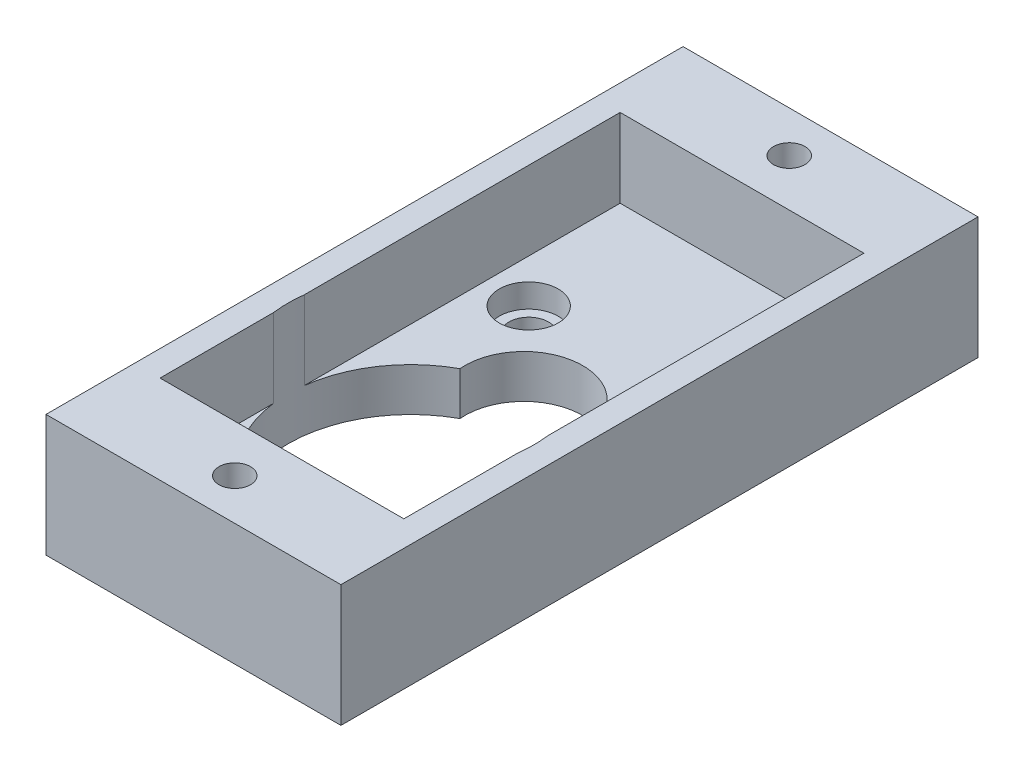
ISO-10303-21;
HEADER;
FILE_DESCRIPTION(('STEP AP214'),'2;1');
FILE_NAME('part.step','',(''),(''),'','','');
FILE_SCHEMA(('AUTOMOTIVE_DESIGN { 1 0 10303 214 1 1 1 1 }'));
ENDSEC;
DATA;
#1=APPLICATION_CONTEXT('core data for automotive mechanical design processes');
#2=APPLICATION_PROTOCOL_DEFINITION('international standard','automotive_design',2000,#1);
#3=PRODUCT_CONTEXT('',#1,'mechanical');
#4=PRODUCT('Part','Part','',(#3));
#5=PRODUCT_RELATED_PRODUCT_CATEGORY('part','',(#4));
#6=PRODUCT_DEFINITION_FORMATION('','',#4);
#7=PRODUCT_DEFINITION_CONTEXT('part definition',#1,'design');
#8=PRODUCT_DEFINITION('design','',#6,#7);
#9=PRODUCT_DEFINITION_SHAPE('','',#8);
#10=(LENGTH_UNIT() NAMED_UNIT(*) SI_UNIT(.MILLI.,.METRE.));
#11=(NAMED_UNIT(*) PLANE_ANGLE_UNIT() SI_UNIT($,.RADIAN.));
#12=(NAMED_UNIT(*) SI_UNIT($,.STERADIAN.) SOLID_ANGLE_UNIT());
#13=UNCERTAINTY_MEASURE_WITH_UNIT(LENGTH_MEASURE(1.E-05),#10,'distance_accuracy_value','');
#14=(GEOMETRIC_REPRESENTATION_CONTEXT(3) GLOBAL_UNCERTAINTY_ASSIGNED_CONTEXT((#13)) GLOBAL_UNIT_ASSIGNED_CONTEXT((#10,
#11,#12)) REPRESENTATION_CONTEXT('',''));
#15=CARTESIAN_POINT('',(0.,0.,0.));
#16=DIRECTION('',(0.,0.,1.));
#17=DIRECTION('',(1.,0.,0.));
#18=AXIS2_PLACEMENT_3D('',#15,#16,#17);
#19=CARTESIAN_POINT('',(11.5,0.,11.35));
#20=DIRECTION('',(0.,1.,0.));
#21=DIRECTION('',(0.,0.,1.));
#22=AXIS2_PLACEMENT_3D('',#19,#20,#21);
#23=CYLINDRICAL_SURFACE('',#22,1.);
#24=CARTESIAN_POINT('',(11.5,0.,11.35));
#25=DIRECTION('',(0.,1.,0.));
#26=DIRECTION('',(0.,0.,1.));
#27=AXIS2_PLACEMENT_3D('',#24,#25,#26);
#28=CIRCLE('',#27,1.);
#29=CARTESIAN_POINT('',(11.5,0.,12.35));
#30=VERTEX_POINT('',#29);
#31=EDGE_CURVE('E677',#30,#30,#28,.T.);
#32=ORIENTED_EDGE('',*,*,#31,.F.);
#33=EDGE_LOOP('',(#32));
#34=FACE_BOUND('',#33,.T.);
#35=CARTESIAN_POINT('',(11.5,1.,11.35));
#36=DIRECTION('',(0.,1.,0.));
#37=DIRECTION('',(0.,0.,1.));
#38=AXIS2_PLACEMENT_3D('',#35,#36,#37);
#39=CIRCLE('',#38,1.);
#40=CARTESIAN_POINT('',(11.5,1.,12.35));
#41=VERTEX_POINT('',#40);
#42=EDGE_CURVE('E670',#41,#41,#39,.T.);
#43=ORIENTED_EDGE('',*,*,#42,.T.);
#44=EDGE_LOOP('',(#43));
#45=FACE_BOUND('',#44,.T.);
#46=ADVANCED_FACE('F46',(#34,#45),#23,.F.);
#47=CARTESIAN_POINT('',(3.5,0.,11.35));
#48=DIRECTION('',(0.,1.,0.));
#49=DIRECTION('',(0.,0.,1.));
#50=AXIS2_PLACEMENT_3D('',#47,#48,#49);
#51=CYLINDRICAL_SURFACE('',#50,1.);
#52=CARTESIAN_POINT('',(3.5,0.,11.35));
#53=DIRECTION('',(0.,1.,0.));
#54=DIRECTION('',(0.,0.,1.));
#55=AXIS2_PLACEMENT_3D('',#52,#53,#54);
#56=CIRCLE('',#55,1.);
#57=CARTESIAN_POINT('',(3.5,0.,12.35));
#58=VERTEX_POINT('',#57);
#59=EDGE_CURVE('E675',#58,#58,#56,.T.);
#60=ORIENTED_EDGE('',*,*,#59,.F.);
#61=EDGE_LOOP('',(#60));
#62=FACE_BOUND('',#61,.T.);
#63=CARTESIAN_POINT('',(3.5,1.,11.35));
#64=DIRECTION('',(0.,1.,0.));
#65=DIRECTION('',(0.,0.,1.));
#66=AXIS2_PLACEMENT_3D('',#63,#64,#65);
#67=CIRCLE('',#66,1.);
#68=CARTESIAN_POINT('',(3.5,1.,12.35));
#69=VERTEX_POINT('',#68);
#70=EDGE_CURVE('E667',#69,#69,#67,.T.);
#71=ORIENTED_EDGE('',*,*,#70,.T.);
#72=EDGE_LOOP('',(#71));
#73=FACE_BOUND('',#72,.T.);
#74=ADVANCED_FACE('F277',(#62,#73),#51,.F.);
#75=CARTESIAN_POINT('',(0.,2.2,0.));
#76=DIRECTION('',(0.,-1.,0.));
#77=DIRECTION('',(0.,0.,-1.));
#78=AXIS2_PLACEMENT_3D('',#75,#76,#77);
#79=PLANE('',#78);
#80=CARTESIAN_POINT('',(11.5,2.2,11.35));
#81=DIRECTION('',(0.,1.,0.));
#82=DIRECTION('',(0.,0.,1.));
#83=AXIS2_PLACEMENT_3D('',#80,#81,#82);
#84=CIRCLE('',#83,1.5);
#85=CARTESIAN_POINT('',(11.5,2.2,12.85));
#86=VERTEX_POINT('',#85);
#87=EDGE_CURVE('E661',#86,#86,#84,.T.);
#88=ORIENTED_EDGE('',*,*,#87,.F.);
#89=EDGE_LOOP('',(#88));
#90=FACE_BOUND('',#89,.T.);
#91=CARTESIAN_POINT('',(3.5,2.2,11.35));
#92=DIRECTION('',(0.,1.,0.));
#93=DIRECTION('',(0.,0.,1.));
#94=AXIS2_PLACEMENT_3D('',#91,#92,#93);
#95=CIRCLE('',#94,1.5);
#96=CARTESIAN_POINT('',(3.5,2.2,12.85));
#97=VERTEX_POINT('',#96);
#98=EDGE_CURVE('E664',#97,#97,#95,.T.);
#99=ORIENTED_EDGE('',*,*,#98,.F.);
#100=EDGE_LOOP('',(#99));
#101=FACE_BOUND('',#100,.T.);
#102=CARTESIAN_POINT('',(7.5,2.2,21.35));
#103=DIRECTION('',(0.,1.,0.));
#104=DIRECTION('',(0.,0.,1.));
#105=AXIS2_PLACEMENT_3D('',#102,#103,#104);
#106=CIRCLE('',#105,6.25);
#107=CARTESIAN_POINT('',(13.7,2.2,20.561013308097));
#108=VERTEX_POINT('',#107);
#109=CARTESIAN_POINT('',(10.4886363227973,2.2,15.8608695652174));
#110=VERTEX_POINT('',#109);
#111=EDGE_CURVE('E238',#108,#110,#106,.T.);
#112=ORIENTED_EDGE('',*,*,#111,.F.);
#113=DIRECTION('',(0.,0.,-1.));
#114=VECTOR('',#113,1.);
#115=CARTESIAN_POINT('',(13.7,2.2,0.));
#116=LINE('',#115,#114);
#117=CARTESIAN_POINT('',(13.7,2.2,4.5));
#118=VERTEX_POINT('',#117);
#119=EDGE_CURVE('E177',#108,#118,#116,.T.);
#120=ORIENTED_EDGE('',*,*,#119,.T.);
#121=DIRECTION('',(-1.,0.,0.));
#122=VECTOR('',#121,1.);
#123=CARTESIAN_POINT('',(0.,2.2,4.50000000000001));
#124=LINE('',#123,#122);
#125=CARTESIAN_POINT('',(1.3,2.2,4.50000000000001));
#126=VERTEX_POINT('',#125);
#127=EDGE_CURVE('E208',#118,#126,#124,.T.);
#128=ORIENTED_EDGE('',*,*,#127,.T.);
#129=DIRECTION('',(0.,0.,1.));
#130=VECTOR('',#129,1.);
#131=CARTESIAN_POINT('',(1.3,2.2,0.));
#132=LINE('',#131,#130);
#133=CARTESIAN_POINT('',(1.3,2.2,20.561013308097));
#134=VERTEX_POINT('',#133);
#135=EDGE_CURVE('E207',#126,#134,#132,.T.);
#136=ORIENTED_EDGE('',*,*,#135,.T.);
#137=CARTESIAN_POINT('',(4.5113636772027,2.2,15.8608695652174));
#138=VERTEX_POINT('',#137);
#139=EDGE_CURVE('E234',#138,#134,#106,.T.);
#140=ORIENTED_EDGE('',*,*,#139,.F.);
#141=CARTESIAN_POINT('',(7.49999999999999,2.2,15.6));
#142=DIRECTION('',(0.,1.,0.));
#143=DIRECTION('',(0.,0.,1.));
#144=AXIS2_PLACEMENT_3D('',#141,#142,#143);
#145=CIRCLE('',#144,3.);
#146=EDGE_CURVE('E71',#110,#138,#145,.T.);
#147=ORIENTED_EDGE('',*,*,#146,.F.);
#148=EDGE_LOOP('',(#112,#120,#128,#136,#140,#147));
#149=FACE_BOUND('',#148,.T.);
#150=ADVANCED_FACE('F272',(#90,#101,#149),#79,.F.);
#151=CARTESIAN_POINT('',(0.,2.2,0.));
#152=DIRECTION('',(0.,0.,-1.));
#153=DIRECTION('',(-1.,0.,0.));
#154=AXIS2_PLACEMENT_3D('',#151,#152,#153);
#155=PLANE('',#154);
#156=DIRECTION('',(1.,0.,0.));
#157=VECTOR('',#156,1.);
#158=CARTESIAN_POINT('',(0.,0.,0.));
#159=LINE('',#158,#157);
#160=CARTESIAN_POINT('',(0.,0.,0.));
#161=VERTEX_POINT('',#160);
#162=CARTESIAN_POINT('',(15.,0.,0.));
#163=VERTEX_POINT('',#162);
#164=EDGE_CURVE('E244',#161,#163,#159,.T.);
#165=ORIENTED_EDGE('',*,*,#164,.F.);
#166=DIRECTION('',(0.,-1.,0.));
#167=VECTOR('',#166,1.);
#168=CARTESIAN_POINT('',(0.,2.2,0.));
#169=LINE('',#168,#167);
#170=CARTESIAN_POINT('',(0.,6.2,0.));
#171=VERTEX_POINT('',#170);
#172=EDGE_CURVE('E12',#171,#161,#169,.T.);
#173=ORIENTED_EDGE('',*,*,#172,.F.);
#174=DIRECTION('',(-1.,0.,0.));
#175=VECTOR('',#174,1.);
#176=CARTESIAN_POINT('',(0.,6.2,0.));
#177=LINE('',#176,#175);
#178=CARTESIAN_POINT('',(15.,6.2,0.));
#179=VERTEX_POINT('',#178);
#180=EDGE_CURVE('E173',#179,#171,#177,.T.);
#181=ORIENTED_EDGE('',*,*,#180,.F.);
#182=DIRECTION('',(0.,-1.,0.));
#183=VECTOR('',#182,1.);
#184=CARTESIAN_POINT('',(15.,2.2,0.));
#185=LINE('',#184,#183);
#186=EDGE_CURVE('E50',#179,#163,#185,.T.);
#187=ORIENTED_EDGE('',*,*,#186,.T.);
#188=EDGE_LOOP('',(#165,#173,#181,#187));
#189=FACE_BOUND('',#188,.T.);
#190=ADVANCED_FACE('F48',(#189),#155,.T.);
#191=CARTESIAN_POINT('',(0.,2.2,0.));
#192=DIRECTION('',(1.,0.,0.));
#193=DIRECTION('',(0.,0.,-1.));
#194=AXIS2_PLACEMENT_3D('',#191,#192,#193);
#195=PLANE('',#194);
#196=DIRECTION('',(0.,0.,1.));
#197=VECTOR('',#196,1.);
#198=CARTESIAN_POINT('',(0.,0.,0.));
#199=LINE('',#198,#197);
#200=CARTESIAN_POINT('',(0.,0.,32.4));
#201=VERTEX_POINT('',#200);
#202=EDGE_CURVE('E155',#161,#201,#199,.T.);
#203=ORIENTED_EDGE('',*,*,#202,.T.);
#204=DIRECTION('',(0.,-1.,0.));
#205=VECTOR('',#204,1.);
#206=CARTESIAN_POINT('',(0.,2.2,32.4));
#207=LINE('',#206,#205);
#208=CARTESIAN_POINT('',(0.,6.2,32.4));
#209=VERTEX_POINT('',#208);
#210=EDGE_CURVE('E55',#209,#201,#207,.T.);
#211=ORIENTED_EDGE('',*,*,#210,.F.);
#212=DIRECTION('',(0.,0.,1.));
#213=VECTOR('',#212,1.);
#214=CARTESIAN_POINT('',(0.,6.2,0.));
#215=LINE('',#214,#213);
#216=EDGE_CURVE('E153',#171,#209,#215,.T.);
#217=ORIENTED_EDGE('',*,*,#216,.F.);
#218=ORIENTED_EDGE('',*,*,#172,.T.);
#219=EDGE_LOOP('',(#203,#211,#217,#218));
#220=FACE_BOUND('',#219,.T.);
#221=ADVANCED_FACE('F151',(#220),#195,.F.);
#222=CARTESIAN_POINT('',(0.,2.2,32.4));
#223=DIRECTION('',(0.,0.,-1.));
#224=DIRECTION('',(-1.,0.,0.));
#225=AXIS2_PLACEMENT_3D('',#222,#223,#224);
#226=PLANE('',#225);
#227=DIRECTION('',(1.,0.,0.));
#228=VECTOR('',#227,1.);
#229=CARTESIAN_POINT('',(0.,0.,32.4));
#230=LINE('',#229,#228);
#231=CARTESIAN_POINT('',(15.,0.,32.4));
#232=VERTEX_POINT('',#231);
#233=EDGE_CURVE('E250',#201,#232,#230,.T.);
#234=ORIENTED_EDGE('',*,*,#233,.T.);
#235=DIRECTION('',(0.,-1.,0.));
#236=VECTOR('',#235,1.);
#237=CARTESIAN_POINT('',(15.,2.2,32.4));
#238=LINE('',#237,#236);
#239=CARTESIAN_POINT('',(15.,6.2,32.4));
#240=VERTEX_POINT('',#239);
#241=EDGE_CURVE('E159',#240,#232,#238,.T.);
#242=ORIENTED_EDGE('',*,*,#241,.F.);
#243=DIRECTION('',(1.,0.,0.));
#244=VECTOR('',#243,1.);
#245=CARTESIAN_POINT('',(0.,6.2,32.4));
#246=LINE('',#245,#244);
#247=EDGE_CURVE('E162',#209,#240,#246,.T.);
#248=ORIENTED_EDGE('',*,*,#247,.F.);
#249=ORIENTED_EDGE('',*,*,#210,.T.);
#250=EDGE_LOOP('',(#234,#242,#248,#249));
#251=FACE_BOUND('',#250,.T.);
#252=ADVANCED_FACE('F163',(#251),#226,.F.);
#253=CARTESIAN_POINT('',(15.,2.2,0.));
#254=DIRECTION('',(1.,0.,0.));
#255=DIRECTION('',(0.,0.,-1.));
#256=AXIS2_PLACEMENT_3D('',#253,#254,#255);
#257=PLANE('',#256);
#258=DIRECTION('',(0.,0.,1.));
#259=VECTOR('',#258,1.);
#260=CARTESIAN_POINT('',(15.,0.,0.));
#261=LINE('',#260,#259);
#262=EDGE_CURVE('E247',#163,#232,#261,.T.);
#263=ORIENTED_EDGE('',*,*,#262,.F.);
#264=ORIENTED_EDGE('',*,*,#186,.F.);
#265=DIRECTION('',(0.,0.,-1.));
#266=VECTOR('',#265,1.);
#267=CARTESIAN_POINT('',(15.,6.2,0.));
#268=LINE('',#267,#266);
#269=EDGE_CURVE('E167',#240,#179,#268,.T.);
#270=ORIENTED_EDGE('',*,*,#269,.F.);
#271=ORIENTED_EDGE('',*,*,#241,.T.);
#272=EDGE_LOOP('',(#263,#264,#270,#271));
#273=FACE_BOUND('',#272,.T.);
#274=ADVANCED_FACE('F256',(#273),#257,.T.);
#275=DIRECTION('',(-1.,0.,0.));
#276=VECTOR('',#275,1.);
#277=CARTESIAN_POINT('',(0.,2.2,27.9));
#278=LINE('',#277,#276);
#279=CARTESIAN_POINT('',(13.7,2.2,27.9));
#280=VERTEX_POINT('',#279);
#281=CARTESIAN_POINT('',(1.3,2.2,27.9));
#282=VERTEX_POINT('',#281);
#283=EDGE_CURVE('E63',#280,#282,#278,.T.);
#284=ORIENTED_EDGE('',*,*,#283,.F.);
#285=CARTESIAN_POINT('',(13.7,2.2,22.138986691903));
#286=VERTEX_POINT('',#285);
#287=EDGE_CURVE('E174',#280,#286,#116,.T.);
#288=ORIENTED_EDGE('',*,*,#287,.T.);
#289=CARTESIAN_POINT('',(1.3,2.2,22.138986691903));
#290=VERTEX_POINT('',#289);
#291=EDGE_CURVE('E237',#290,#286,#106,.T.);
#292=ORIENTED_EDGE('',*,*,#291,.F.);
#293=EDGE_CURVE('E203',#290,#282,#132,.T.);
#294=ORIENTED_EDGE('',*,*,#293,.T.);
#295=EDGE_LOOP('',(#284,#288,#292,#294));
#296=FACE_BOUND('',#295,.T.);
#297=ADVANCED_FACE('F261',(#296),#79,.F.);
#298=CARTESIAN_POINT('',(0.,0.,0.));
#299=DIRECTION('',(0.,-1.,0.));
#300=DIRECTION('',(0.,0.,-1.));
#301=AXIS2_PLACEMENT_3D('',#298,#299,#300);
#302=PLANE('',#301);
#303=ORIENTED_EDGE('',*,*,#59,.T.);
#304=EDGE_LOOP('',(#303));
#305=FACE_BOUND('',#304,.T.);
#306=ORIENTED_EDGE('',*,*,#31,.T.);
#307=EDGE_LOOP('',(#306));
#308=FACE_BOUND('',#307,.T.);
#309=CARTESIAN_POINT('',(7.5,0.,21.35));
#310=DIRECTION('',(0.,1.,0.));
#311=DIRECTION('',(0.,0.,1.));
#312=AXIS2_PLACEMENT_3D('',#309,#310,#311);
#313=CIRCLE('',#312,6.25);
#314=CARTESIAN_POINT('',(4.5113636772027,0.,15.8608695652174));
#315=VERTEX_POINT('',#314);
#316=CARTESIAN_POINT('',(10.4886363227973,0.,15.8608695652174));
#317=VERTEX_POINT('',#316);
#318=EDGE_CURVE('E228',#315,#317,#313,.T.);
#319=ORIENTED_EDGE('',*,*,#318,.T.);
#320=CARTESIAN_POINT('',(7.49999999999999,0.,15.6));
#321=DIRECTION('',(0.,1.,0.));
#322=DIRECTION('',(0.,0.,1.));
#323=AXIS2_PLACEMENT_3D('',#320,#321,#322);
#324=CIRCLE('',#323,3.);
#325=EDGE_CURVE('E231',#317,#315,#324,.T.);
#326=ORIENTED_EDGE('',*,*,#325,.T.);
#327=EDGE_LOOP('',(#319,#326));
#328=FACE_BOUND('',#327,.T.);
#329=ORIENTED_EDGE('',*,*,#164,.T.);
#330=ORIENTED_EDGE('',*,*,#262,.T.);
#331=ORIENTED_EDGE('',*,*,#233,.F.);
#332=ORIENTED_EDGE('',*,*,#202,.F.);
#333=EDGE_LOOP('',(#329,#330,#331,#332));
#334=FACE_BOUND('',#333,.T.);
#335=ADVANCED_FACE('F258',(#305,#308,#328,#334),#302,.T.);
#336=CARTESIAN_POINT('',(7.49999999999999,2.2,15.6));
#337=DIRECTION('',(0.,-1.,0.));
#338=DIRECTION('',(0.,0.,-1.));
#339=AXIS2_PLACEMENT_3D('',#336,#337,#338);
#340=CYLINDRICAL_SURFACE('',#339,3.);
#341=DIRECTION('',(0.,-1.,0.));
#342=VECTOR('',#341,1.);
#343=CARTESIAN_POINT('',(4.5113636772027,1.1,15.8608695652174));
#344=LINE('',#343,#342);
#345=EDGE_CURVE('E242',#138,#315,#344,.T.);
#346=ORIENTED_EDGE('',*,*,#345,.T.);
#347=ORIENTED_EDGE('',*,*,#325,.F.);
#348=DIRECTION('',(0.,-1.,0.));
#349=VECTOR('',#348,1.);
#350=CARTESIAN_POINT('',(10.4886363227973,1.1,15.8608695652174));
#351=LINE('',#350,#349);
#352=EDGE_CURVE('E230',#317,#110,#351,.F.);
#353=ORIENTED_EDGE('',*,*,#352,.T.);
#354=ORIENTED_EDGE('',*,*,#146,.T.);
#355=EDGE_LOOP('',(#346,#347,#353,#354));
#356=FACE_BOUND('',#355,.T.);
#357=ADVANCED_FACE('F260',(#356),#340,.F.);
#358=CARTESIAN_POINT('',(7.5,2.2,21.35));
#359=DIRECTION('',(0.,-1.,0.));
#360=DIRECTION('',(0.,0.,-1.));
#361=AXIS2_PLACEMENT_3D('',#358,#359,#360);
#362=CYLINDRICAL_SURFACE('',#361,6.25);
#363=ORIENTED_EDGE('',*,*,#139,.T.);
#364=DIRECTION('',(0.,-1.,0.));
#365=VECTOR('',#364,1.);
#366=CARTESIAN_POINT('',(1.3,6.2,20.561013308097));
#367=LINE('',#366,#365);
#368=CARTESIAN_POINT('',(1.3,6.2,20.561013308097));
#369=VERTEX_POINT('',#368);
#370=EDGE_CURVE('E222',#369,#134,#367,.T.);
#371=ORIENTED_EDGE('',*,*,#370,.F.);
#372=CARTESIAN_POINT('',(7.5,6.2,21.35));
#373=DIRECTION('',(0.,1.,0.));
#374=DIRECTION('',(0.,0.,1.));
#375=AXIS2_PLACEMENT_3D('',#372,#373,#374);
#376=CIRCLE('',#375,6.25);
#377=CARTESIAN_POINT('',(1.3,6.2,22.138986691903));
#378=VERTEX_POINT('',#377);
#379=EDGE_CURVE('E190',#378,#369,#376,.F.);
#380=ORIENTED_EDGE('',*,*,#379,.F.);
#381=DIRECTION('',(0.,-1.,0.));
#382=VECTOR('',#381,1.);
#383=CARTESIAN_POINT('',(1.3,6.2,22.138986691903));
#384=LINE('',#383,#382);
#385=EDGE_CURVE('E224',#378,#290,#384,.T.);
#386=ORIENTED_EDGE('',*,*,#385,.T.);
#387=ORIENTED_EDGE('',*,*,#291,.T.);
#388=DIRECTION('',(0.,-1.,0.));
#389=VECTOR('',#388,1.);
#390=CARTESIAN_POINT('',(13.7,6.2,22.138986691903));
#391=LINE('',#390,#389);
#392=CARTESIAN_POINT('',(13.7,6.2,22.138986691903));
#393=VERTEX_POINT('',#392);
#394=EDGE_CURVE('E214',#393,#286,#391,.T.);
#395=ORIENTED_EDGE('',*,*,#394,.F.);
#396=CARTESIAN_POINT('',(7.5,6.2,21.35));
#397=DIRECTION('',(0.,1.,0.));
#398=DIRECTION('',(0.,0.,1.));
#399=AXIS2_PLACEMENT_3D('',#396,#397,#398);
#400=CIRCLE('',#399,6.25);
#401=CARTESIAN_POINT('',(13.7,6.2,20.561013308097));
#402=VERTEX_POINT('',#401);
#403=EDGE_CURVE('E199',#402,#393,#400,.F.);
#404=ORIENTED_EDGE('',*,*,#403,.F.);
#405=DIRECTION('',(0.,-1.,0.));
#406=VECTOR('',#405,1.);
#407=CARTESIAN_POINT('',(13.7,6.2,20.561013308097));
#408=LINE('',#407,#406);
#409=EDGE_CURVE('E216',#402,#108,#408,.T.);
#410=ORIENTED_EDGE('',*,*,#409,.T.);
#411=ORIENTED_EDGE('',*,*,#111,.T.);
#412=ORIENTED_EDGE('',*,*,#352,.F.);
#413=ORIENTED_EDGE('',*,*,#318,.F.);
#414=ORIENTED_EDGE('',*,*,#345,.F.);
#415=EDGE_LOOP('',(#363,#371,#380,#386,#387,#395,#404,#410,#411,#412,#413,#414));
#416=FACE_BOUND('',#415,.T.);
#417=ADVANCED_FACE('F268',(#416),#362,.F.);
#418=CARTESIAN_POINT('',(0.,6.2,27.9));
#419=DIRECTION('',(0.,0.,1.));
#420=DIRECTION('',(1.,0.,0.));
#421=AXIS2_PLACEMENT_3D('',#418,#419,#420);
#422=PLANE('',#421);
#423=ORIENTED_EDGE('',*,*,#283,.T.);
#424=DIRECTION('',(0.,-1.,0.));
#425=VECTOR('',#424,1.);
#426=CARTESIAN_POINT('',(1.3,6.2,27.9));
#427=LINE('',#426,#425);
#428=CARTESIAN_POINT('',(1.3,6.2,27.9));
#429=VERTEX_POINT('',#428);
#430=EDGE_CURVE('E226',#429,#282,#427,.T.);
#431=ORIENTED_EDGE('',*,*,#430,.F.);
#432=DIRECTION('',(-1.,0.,0.));
#433=VECTOR('',#432,1.);
#434=CARTESIAN_POINT('',(0.,6.2,27.9));
#435=LINE('',#434,#433);
#436=CARTESIAN_POINT('',(13.7,6.2,27.9));
#437=VERTEX_POINT('',#436);
#438=EDGE_CURVE('E185',#437,#429,#435,.T.);
#439=ORIENTED_EDGE('',*,*,#438,.F.);
#440=DIRECTION('',(0.,-1.,0.));
#441=VECTOR('',#440,1.);
#442=CARTESIAN_POINT('',(13.7,6.2,27.9));
#443=LINE('',#442,#441);
#444=EDGE_CURVE('E212',#437,#280,#443,.T.);
#445=ORIENTED_EDGE('',*,*,#444,.T.);
#446=EDGE_LOOP('',(#423,#431,#439,#445));
#447=FACE_BOUND('',#446,.T.);
#448=ADVANCED_FACE('F323',(#447),#422,.F.);
#449=CARTESIAN_POINT('',(1.3,6.2,0.));
#450=DIRECTION('',(1.,0.,0.));
#451=DIRECTION('',(0.,0.,-1.));
#452=AXIS2_PLACEMENT_3D('',#449,#450,#451);
#453=PLANE('',#452);
#454=ORIENTED_EDGE('',*,*,#293,.F.);
#455=ORIENTED_EDGE('',*,*,#385,.F.);
#456=DIRECTION('',(0.,0.,1.));
#457=VECTOR('',#456,1.);
#458=CARTESIAN_POINT('',(1.3,6.2,0.));
#459=LINE('',#458,#457);
#460=EDGE_CURVE('E187',#378,#429,#459,.T.);
#461=ORIENTED_EDGE('',*,*,#460,.T.);
#462=ORIENTED_EDGE('',*,*,#430,.T.);
#463=EDGE_LOOP('',(#454,#455,#461,#462));
#464=FACE_BOUND('',#463,.T.);
#465=ADVANCED_FACE('F321',(#464),#453,.T.);
#466=ORIENTED_EDGE('',*,*,#135,.F.);
#467=DIRECTION('',(0.,-1.,0.));
#468=VECTOR('',#467,1.);
#469=CARTESIAN_POINT('',(1.3,6.2,4.50000000000001));
#470=LINE('',#469,#468);
#471=CARTESIAN_POINT('',(1.3,6.2,4.50000000000001));
#472=VERTEX_POINT('',#471);
#473=EDGE_CURVE('E220',#472,#126,#470,.T.);
#474=ORIENTED_EDGE('',*,*,#473,.F.);
#475=EDGE_CURVE('E191',#472,#369,#459,.T.);
#476=ORIENTED_EDGE('',*,*,#475,.T.);
#477=ORIENTED_EDGE('',*,*,#370,.T.);
#478=EDGE_LOOP('',(#466,#474,#476,#477));
#479=FACE_BOUND('',#478,.T.);
#480=ADVANCED_FACE('F317',(#479),#453,.T.);
#481=CARTESIAN_POINT('',(0.,6.2,4.50000000000001));
#482=DIRECTION('',(0.,0.,1.));
#483=DIRECTION('',(1.,0.,0.));
#484=AXIS2_PLACEMENT_3D('',#481,#482,#483);
#485=PLANE('',#484);
#486=ORIENTED_EDGE('',*,*,#127,.F.);
#487=DIRECTION('',(0.,-1.,0.));
#488=VECTOR('',#487,1.);
#489=CARTESIAN_POINT('',(13.7,6.2,4.5));
#490=LINE('',#489,#488);
#491=CARTESIAN_POINT('',(13.7,6.2,4.5));
#492=VERTEX_POINT('',#491);
#493=EDGE_CURVE('E218',#492,#118,#490,.T.);
#494=ORIENTED_EDGE('',*,*,#493,.F.);
#495=DIRECTION('',(-1.,0.,0.));
#496=VECTOR('',#495,1.);
#497=CARTESIAN_POINT('',(0.,6.2,4.50000000000001));
#498=LINE('',#497,#496);
#499=EDGE_CURVE('E193',#492,#472,#498,.T.);
#500=ORIENTED_EDGE('',*,*,#499,.T.);
#501=ORIENTED_EDGE('',*,*,#473,.T.);
#502=EDGE_LOOP('',(#486,#494,#500,#501));
#503=FACE_BOUND('',#502,.T.);
#504=ADVANCED_FACE('F314',(#503),#485,.T.);
#505=CARTESIAN_POINT('',(13.7,6.2,0.));
#506=DIRECTION('',(-1.,0.,0.));
#507=DIRECTION('',(0.,0.,1.));
#508=AXIS2_PLACEMENT_3D('',#505,#506,#507);
#509=PLANE('',#508);
#510=ORIENTED_EDGE('',*,*,#119,.F.);
#511=ORIENTED_EDGE('',*,*,#409,.F.);
#512=DIRECTION('',(0.,0.,-1.));
#513=VECTOR('',#512,1.);
#514=CARTESIAN_POINT('',(13.7,6.2,0.));
#515=LINE('',#514,#513);
#516=EDGE_CURVE('E196',#402,#492,#515,.T.);
#517=ORIENTED_EDGE('',*,*,#516,.T.);
#518=ORIENTED_EDGE('',*,*,#493,.T.);
#519=EDGE_LOOP('',(#510,#511,#517,#518));
#520=FACE_BOUND('',#519,.T.);
#521=ADVANCED_FACE('F312',(#520),#509,.T.);
#522=ORIENTED_EDGE('',*,*,#287,.F.);
#523=ORIENTED_EDGE('',*,*,#444,.F.);
#524=EDGE_CURVE('E200',#437,#393,#515,.T.);
#525=ORIENTED_EDGE('',*,*,#524,.T.);
#526=ORIENTED_EDGE('',*,*,#394,.T.);
#527=EDGE_LOOP('',(#522,#523,#525,#526));
#528=FACE_BOUND('',#527,.T.);
#529=ADVANCED_FACE('F308',(#528),#509,.T.);
#530=CARTESIAN_POINT('',(0.,6.2,0.));
#531=DIRECTION('',(0.,1.,0.));
#532=DIRECTION('',(0.,0.,1.));
#533=AXIS2_PLACEMENT_3D('',#530,#531,#532);
#534=PLANE('',#533);
#535=CARTESIAN_POINT('',(7.50000000000002,6.2,2.1));
#536=DIRECTION('',(0.,1.,0.));
#537=DIRECTION('',(-1.,0.,0.));
#538=AXIS2_PLACEMENT_3D('',#535,#536,#537);
#539=CIRCLE('',#538,0.800000000000001);
#540=CARTESIAN_POINT('',(6.70000000000002,6.2,2.1));
#541=VERTEX_POINT('',#540);
#542=EDGE_CURVE('E683',#541,#541,#539,.T.);
#543=ORIENTED_EDGE('',*,*,#542,.F.);
#544=EDGE_LOOP('',(#543));
#545=FACE_BOUND('',#544,.T.);
#546=CARTESIAN_POINT('',(7.50000000000002,6.2,30.3));
#547=DIRECTION('',(0.,1.,0.));
#548=DIRECTION('',(-1.,0.,0.));
#549=AXIS2_PLACEMENT_3D('',#546,#547,#548);
#550=CIRCLE('',#549,0.8);
#551=CARTESIAN_POINT('',(6.70000000000002,6.2,30.3));
#552=VERTEX_POINT('',#551);
#553=EDGE_CURVE('E685',#552,#552,#550,.T.);
#554=ORIENTED_EDGE('',*,*,#553,.F.);
#555=EDGE_LOOP('',(#554));
#556=FACE_BOUND('',#555,.T.);
#557=ORIENTED_EDGE('',*,*,#216,.T.);
#558=ORIENTED_EDGE('',*,*,#247,.T.);
#559=ORIENTED_EDGE('',*,*,#269,.T.);
#560=ORIENTED_EDGE('',*,*,#180,.T.);
#561=EDGE_LOOP('',(#557,#558,#559,#560));
#562=FACE_BOUND('',#561,.T.);
#563=ORIENTED_EDGE('',*,*,#438,.T.);
#564=ORIENTED_EDGE('',*,*,#460,.F.);
#565=ORIENTED_EDGE('',*,*,#379,.T.);
#566=ORIENTED_EDGE('',*,*,#475,.F.);
#567=ORIENTED_EDGE('',*,*,#499,.F.);
#568=ORIENTED_EDGE('',*,*,#516,.F.);
#569=ORIENTED_EDGE('',*,*,#403,.T.);
#570=ORIENTED_EDGE('',*,*,#524,.F.);
#571=EDGE_LOOP('',(#563,#564,#565,#566,#567,#568,#569,#570));
#572=FACE_BOUND('',#571,.T.);
#573=ADVANCED_FACE('F170',(#545,#556,#562,#572),#534,.T.);
#574=CARTESIAN_POINT('',(7.50000000000002,3.2,30.3));
#575=DIRECTION('',(0.,1.,0.));
#576=DIRECTION('',(-1.,0.,0.));
#577=AXIS2_PLACEMENT_3D('',#574,#575,#576);
#578=CYLINDRICAL_SURFACE('',#577,0.8);
#579=CARTESIAN_POINT('',(7.50000000000002,3.2,30.3));
#580=DIRECTION('',(0.,1.,0.));
#581=DIRECTION('',(-1.,0.,0.));
#582=AXIS2_PLACEMENT_3D('',#579,#580,#581);
#583=CIRCLE('',#582,0.8);
#584=CARTESIAN_POINT('',(6.70000000000002,3.2,30.3));
#585=VERTEX_POINT('',#584);
#586=EDGE_CURVE('E180',#585,#585,#583,.T.);
#587=ORIENTED_EDGE('',*,*,#586,.F.);
#588=EDGE_LOOP('',(#587));
#589=FACE_BOUND('',#588,.T.);
#590=ORIENTED_EDGE('',*,*,#553,.T.);
#591=EDGE_LOOP('',(#590));
#592=FACE_BOUND('',#591,.T.);
#593=ADVANCED_FACE('F299',(#589,#592),#578,.F.);
#594=CARTESIAN_POINT('',(7.50000000000002,3.2,30.3));
#595=DIRECTION('',(0.,1.,0.));
#596=DIRECTION('',(-1.,0.,0.));
#597=AXIS2_PLACEMENT_3D('',#594,#595,#596);
#598=PLANE('',#597);
#599=ORIENTED_EDGE('',*,*,#586,.T.);
#600=EDGE_LOOP('',(#599));
#601=FACE_BOUND('',#600,.T.);
#602=ADVANCED_FACE('F297',(#601),#598,.T.);
#603=CARTESIAN_POINT('',(7.50000000000002,3.2,2.1));
#604=DIRECTION('',(0.,1.,0.));
#605=DIRECTION('',(-1.,0.,0.));
#606=AXIS2_PLACEMENT_3D('',#603,#604,#605);
#607=CYLINDRICAL_SURFACE('',#606,0.800000000000001);
#608=CARTESIAN_POINT('',(7.50000000000002,3.2,2.1));
#609=DIRECTION('',(0.,1.,0.));
#610=DIRECTION('',(-1.,0.,0.));
#611=AXIS2_PLACEMENT_3D('',#608,#609,#610);
#612=CIRCLE('',#611,0.800000000000001);
#613=CARTESIAN_POINT('',(6.70000000000002,3.2,2.1));
#614=VERTEX_POINT('',#613);
#615=EDGE_CURVE('E204',#614,#614,#612,.T.);
#616=ORIENTED_EDGE('',*,*,#615,.F.);
#617=EDGE_LOOP('',(#616));
#618=FACE_BOUND('',#617,.T.);
#619=ORIENTED_EDGE('',*,*,#542,.T.);
#620=EDGE_LOOP('',(#619));
#621=FACE_BOUND('',#620,.T.);
#622=ADVANCED_FACE('F293',(#618,#621),#607,.F.);
#623=CARTESIAN_POINT('',(7.50000000000002,3.2,2.1));
#624=DIRECTION('',(0.,1.,0.));
#625=DIRECTION('',(-1.,0.,0.));
#626=AXIS2_PLACEMENT_3D('',#623,#624,#625);
#627=PLANE('',#626);
#628=ORIENTED_EDGE('',*,*,#615,.T.);
#629=EDGE_LOOP('',(#628));
#630=FACE_BOUND('',#629,.T.);
#631=ADVANCED_FACE('F289',(#630),#627,.T.);
#632=CARTESIAN_POINT('',(3.5,1.,11.35));
#633=DIRECTION('',(0.,1.,0.));
#634=DIRECTION('',(0.,0.,1.));
#635=AXIS2_PLACEMENT_3D('',#632,#633,#634);
#636=CYLINDRICAL_SURFACE('',#635,1.5);
#637=CARTESIAN_POINT('',(3.5,1.,11.35));
#638=DIRECTION('',(0.,1.,0.));
#639=DIRECTION('',(0.,0.,1.));
#640=AXIS2_PLACEMENT_3D('',#637,#638,#639);
#641=CIRCLE('',#640,1.5);
#642=CARTESIAN_POINT('',(3.5,1.,12.85));
#643=VERTEX_POINT('',#642);
#644=EDGE_CURVE('E666',#643,#643,#641,.T.);
#645=ORIENTED_EDGE('',*,*,#644,.F.);
#646=EDGE_LOOP('',(#645));
#647=FACE_BOUND('',#646,.T.);
#648=ORIENTED_EDGE('',*,*,#98,.T.);
#649=EDGE_LOOP('',(#648));
#650=FACE_BOUND('',#649,.T.);
#651=ADVANCED_FACE('F292',(#647,#650),#636,.F.);
#652=CARTESIAN_POINT('',(3.5,1.,11.35));
#653=DIRECTION('',(0.,1.,0.));
#654=DIRECTION('',(0.,0.,1.));
#655=AXIS2_PLACEMENT_3D('',#652,#653,#654);
#656=PLANE('',#655);
#657=ORIENTED_EDGE('',*,*,#70,.F.);
#658=EDGE_LOOP('',(#657));
#659=FACE_BOUND('',#658,.T.);
#660=ORIENTED_EDGE('',*,*,#644,.T.);
#661=EDGE_LOOP('',(#660));
#662=FACE_BOUND('',#661,.T.);
#663=ADVANCED_FACE('F406',(#659,#662),#656,.T.);
#664=CARTESIAN_POINT('',(11.5,1.,11.35));
#665=DIRECTION('',(0.,1.,0.));
#666=DIRECTION('',(0.,0.,1.));
#667=AXIS2_PLACEMENT_3D('',#664,#665,#666);
#668=CYLINDRICAL_SURFACE('',#667,1.5);
#669=CARTESIAN_POINT('',(11.5,1.,11.35));
#670=DIRECTION('',(0.,1.,0.));
#671=DIRECTION('',(0.,0.,1.));
#672=AXIS2_PLACEMENT_3D('',#669,#670,#671);
#673=CIRCLE('',#672,1.5);
#674=CARTESIAN_POINT('',(11.5,1.,12.85));
#675=VERTEX_POINT('',#674);
#676=EDGE_CURVE('E680',#675,#675,#673,.T.);
#677=ORIENTED_EDGE('',*,*,#676,.F.);
#678=EDGE_LOOP('',(#677));
#679=FACE_BOUND('',#678,.T.);
#680=ORIENTED_EDGE('',*,*,#87,.T.);
#681=EDGE_LOOP('',(#680));
#682=FACE_BOUND('',#681,.T.);
#683=ADVANCED_FACE('F414',(#679,#682),#668,.F.);
#684=CARTESIAN_POINT('',(11.5,1.,11.35));
#685=DIRECTION('',(0.,1.,0.));
#686=DIRECTION('',(0.,0.,1.));
#687=AXIS2_PLACEMENT_3D('',#684,#685,#686);
#688=PLANE('',#687);
#689=ORIENTED_EDGE('',*,*,#42,.F.);
#690=EDGE_LOOP('',(#689));
#691=FACE_BOUND('',#690,.T.);
#692=ORIENTED_EDGE('',*,*,#676,.T.);
#693=EDGE_LOOP('',(#692));
#694=FACE_BOUND('',#693,.T.);
#695=ADVANCED_FACE('F422',(#691,#694),#688,.T.);
#696=CLOSED_SHELL('',(#46,#74,#150,#190,#221,#252,#274,#297,#335,#357,#417,#448,#465,#480,#504,
#521,#529,#573,#593,#602,#622,#631,#651,#663,#683,#695));
#697=MANIFOLD_SOLID_BREP('B2',#696);
#698=ADVANCED_BREP_SHAPE_REPRESENTATION('',(#18,#697),#14);
#699=SHAPE_DEFINITION_REPRESENTATION(#9,#698);
ENDSEC;
END-ISO-10303-21;
